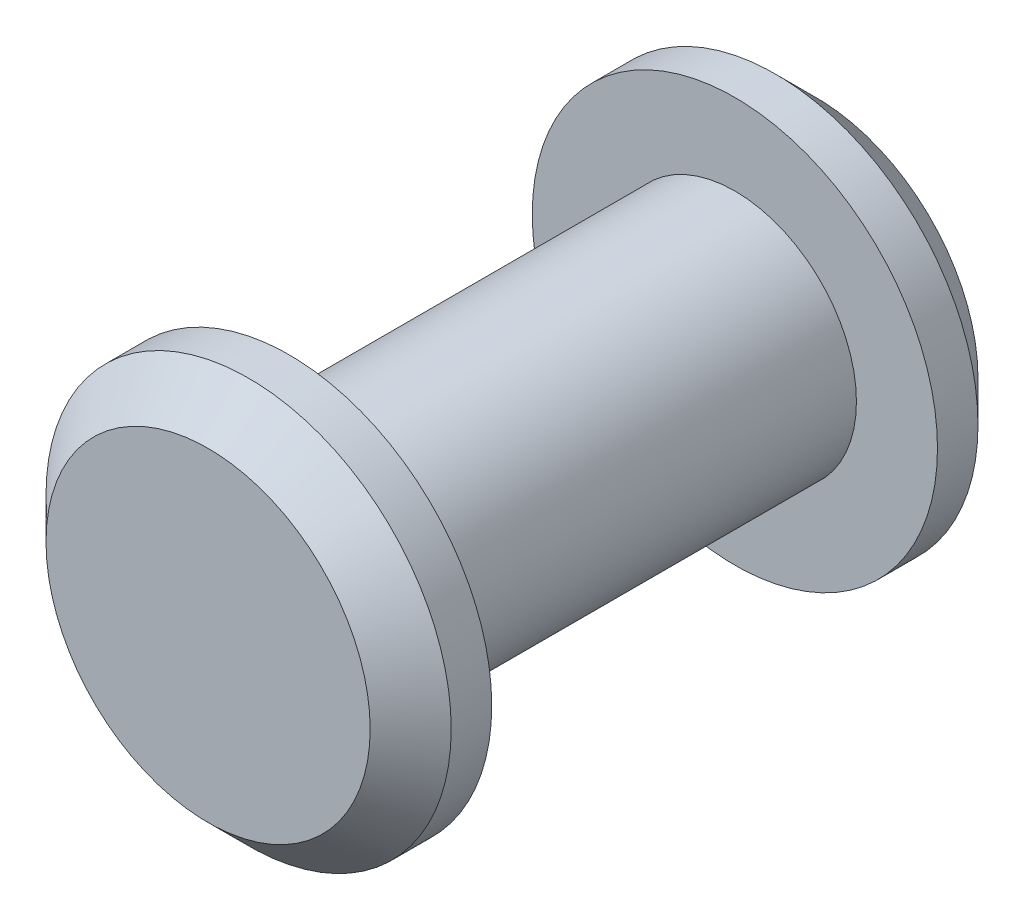
ISO-10303-21;
HEADER;
FILE_DESCRIPTION(('STEP AP214'),'2;1');
FILE_NAME('part.step','',(''),(''),'','','');
FILE_SCHEMA(('AUTOMOTIVE_DESIGN { 1 0 10303 214 1 1 1 1 }'));
ENDSEC;
DATA;
#1=APPLICATION_CONTEXT('core data for automotive mechanical design processes');
#2=APPLICATION_PROTOCOL_DEFINITION('international standard','automotive_design',2000,#1);
#3=PRODUCT_CONTEXT('',#1,'mechanical');
#4=PRODUCT('Part','Part','',(#3));
#5=PRODUCT_RELATED_PRODUCT_CATEGORY('part','',(#4));
#6=PRODUCT_DEFINITION_FORMATION('','',#4);
#7=PRODUCT_DEFINITION_CONTEXT('part definition',#1,'design');
#8=PRODUCT_DEFINITION('design','',#6,#7);
#9=PRODUCT_DEFINITION_SHAPE('','',#8);
#10=(LENGTH_UNIT() NAMED_UNIT(*) SI_UNIT(.MILLI.,.METRE.));
#11=(NAMED_UNIT(*) PLANE_ANGLE_UNIT() SI_UNIT($,.RADIAN.));
#12=(NAMED_UNIT(*) SI_UNIT($,.STERADIAN.) SOLID_ANGLE_UNIT());
#13=UNCERTAINTY_MEASURE_WITH_UNIT(LENGTH_MEASURE(1.E-05),#10,'distance_accuracy_value','');
#14=(GEOMETRIC_REPRESENTATION_CONTEXT(3) GLOBAL_UNCERTAINTY_ASSIGNED_CONTEXT((#13)) GLOBAL_UNIT_ASSIGNED_CONTEXT((#10,
#11,#12)) REPRESENTATION_CONTEXT('',''));
#15=CARTESIAN_POINT('',(0.,0.,0.));
#16=DIRECTION('',(0.,0.,1.));
#17=DIRECTION('',(1.,0.,0.));
#18=AXIS2_PLACEMENT_3D('',#15,#16,#17);
#19=CARTESIAN_POINT('',(0.,0.,-13.));
#20=DIRECTION('',(0.,0.,1.));
#21=DIRECTION('',(1.,0.,0.));
#22=AXIS2_PLACEMENT_3D('',#19,#20,#21);
#23=CONICAL_SURFACE('',#22,10.,0.785398163397447);
#24=CARTESIAN_POINT('',(0.,0.,-15.));
#25=DIRECTION('',(0.,0.,1.));
#26=DIRECTION('',(1.,0.,0.));
#27=AXIS2_PLACEMENT_3D('',#24,#25,#26);
#28=CIRCLE('',#27,8.);
#29=CARTESIAN_POINT('',(8.,0.,-15.));
#30=VERTEX_POINT('',#29);
#31=EDGE_CURVE('E10',#30,#30,#28,.T.);
#32=ORIENTED_EDGE('',*,*,#31,.T.);
#33=EDGE_LOOP('',(#32));
#34=FACE_BOUND('',#33,.T.);
#35=CARTESIAN_POINT('',(0.,0.,-13.));
#36=DIRECTION('',(0.,0.,1.));
#37=DIRECTION('',(1.,0.,0.));
#38=AXIS2_PLACEMENT_3D('',#35,#36,#37);
#39=CIRCLE('',#38,10.);
#40=CARTESIAN_POINT('',(10.,0.,-13.));
#41=VERTEX_POINT('',#40);
#42=EDGE_CURVE('E59',#41,#41,#39,.T.);
#43=ORIENTED_EDGE('',*,*,#42,.F.);
#44=EDGE_LOOP('',(#43));
#45=FACE_BOUND('',#44,.T.);
#46=ADVANCED_FACE('F31',(#34,#45),#23,.T.);
#47=CARTESIAN_POINT('',(0.,0.,-15.));
#48=DIRECTION('',(0.,0.,-1.));
#49=DIRECTION('',(-1.,0.,0.));
#50=AXIS2_PLACEMENT_3D('',#47,#48,#49);
#51=PLANE('',#50);
#52=ORIENTED_EDGE('',*,*,#31,.F.);
#53=EDGE_LOOP('',(#52));
#54=FACE_BOUND('',#53,.T.);
#55=ADVANCED_FACE('F67',(#54),#51,.T.);
#56=CARTESIAN_POINT('',(0.,0.,15.));
#57=DIRECTION('',(0.,0.,1.));
#58=DIRECTION('',(1.,0.,0.));
#59=AXIS2_PLACEMENT_3D('',#56,#57,#58);
#60=PLANE('',#59);
#61=CARTESIAN_POINT('',(0.,0.,15.));
#62=DIRECTION('',(0.,0.,1.));
#63=DIRECTION('',(1.,0.,0.));
#64=AXIS2_PLACEMENT_3D('',#61,#62,#63);
#65=CIRCLE('',#64,8.);
#66=CARTESIAN_POINT('',(8.,0.,15.));
#67=VERTEX_POINT('',#66);
#68=EDGE_CURVE('E37',#67,#67,#65,.T.);
#69=ORIENTED_EDGE('',*,*,#68,.T.);
#70=EDGE_LOOP('',(#69));
#71=FACE_BOUND('',#70,.T.);
#72=ADVANCED_FACE('F71',(#71),#60,.T.);
#73=CARTESIAN_POINT('',(0.,0.,15.));
#74=DIRECTION('',(0.,0.,-1.));
#75=DIRECTION('',(-1.,0.,0.));
#76=AXIS2_PLACEMENT_3D('',#73,#74,#75);
#77=CONICAL_SURFACE('',#76,8.,0.785398163397448);
#78=CARTESIAN_POINT('',(0.,0.,13.));
#79=DIRECTION('',(0.,0.,1.));
#80=DIRECTION('',(1.,0.,0.));
#81=AXIS2_PLACEMENT_3D('',#78,#79,#80);
#82=CIRCLE('',#81,10.);
#83=CARTESIAN_POINT('',(10.,0.,13.));
#84=VERTEX_POINT('',#83);
#85=EDGE_CURVE('E41',#84,#84,#82,.T.);
#86=ORIENTED_EDGE('',*,*,#85,.T.);
#87=EDGE_LOOP('',(#86));
#88=FACE_BOUND('',#87,.T.);
#89=ORIENTED_EDGE('',*,*,#68,.F.);
#90=EDGE_LOOP('',(#89));
#91=FACE_BOUND('',#90,.T.);
#92=ADVANCED_FACE('F76',(#88,#91),#77,.T.);
#93=CARTESIAN_POINT('',(0.,0.,15.));
#94=DIRECTION('',(0.,0.,1.));
#95=DIRECTION('',(1.,0.,0.));
#96=AXIS2_PLACEMENT_3D('',#93,#94,#95);
#97=CYLINDRICAL_SURFACE('',#96,10.);
#98=CARTESIAN_POINT('',(0.,0.,11.));
#99=DIRECTION('',(0.,0.,1.));
#100=DIRECTION('',(1.,0.,0.));
#101=AXIS2_PLACEMENT_3D('',#98,#99,#100);
#102=CIRCLE('',#101,10.);
#103=CARTESIAN_POINT('',(10.,0.,11.));
#104=VERTEX_POINT('',#103);
#105=EDGE_CURVE('E45',#104,#104,#102,.T.);
#106=ORIENTED_EDGE('',*,*,#105,.T.);
#107=EDGE_LOOP('',(#106));
#108=FACE_BOUND('',#107,.T.);
#109=ORIENTED_EDGE('',*,*,#85,.F.);
#110=EDGE_LOOP('',(#109));
#111=FACE_BOUND('',#110,.T.);
#112=ADVANCED_FACE('F81',(#108,#111),#97,.T.);
#113=CARTESIAN_POINT('',(10.,0.,11.));
#114=DIRECTION('',(0.,0.,-1.));
#115=DIRECTION('',(-1.,0.,0.));
#116=AXIS2_PLACEMENT_3D('',#113,#114,#115);
#117=PLANE('',#116);
#118=CARTESIAN_POINT('',(0.,0.,11.));
#119=DIRECTION('',(0.,0.,1.));
#120=DIRECTION('',(1.,0.,0.));
#121=AXIS2_PLACEMENT_3D('',#118,#119,#120);
#122=CIRCLE('',#121,6.);
#123=CARTESIAN_POINT('',(6.,0.,11.));
#124=VERTEX_POINT('',#123);
#125=EDGE_CURVE('E50',#124,#124,#122,.T.);
#126=ORIENTED_EDGE('',*,*,#125,.T.);
#127=EDGE_LOOP('',(#126));
#128=FACE_BOUND('',#127,.T.);
#129=ORIENTED_EDGE('',*,*,#105,.F.);
#130=EDGE_LOOP('',(#129));
#131=FACE_BOUND('',#130,.T.);
#132=ADVANCED_FACE('F85',(#128,#131),#117,.T.);
#133=CARTESIAN_POINT('',(0.,0.,15.));
#134=DIRECTION('',(0.,0.,1.));
#135=DIRECTION('',(1.,0.,0.));
#136=AXIS2_PLACEMENT_3D('',#133,#134,#135);
#137=CYLINDRICAL_SURFACE('',#136,6.);
#138=CARTESIAN_POINT('',(0.,0.,-11.));
#139=DIRECTION('',(0.,0.,1.));
#140=DIRECTION('',(1.,0.,0.));
#141=AXIS2_PLACEMENT_3D('',#138,#139,#140);
#142=CIRCLE('',#141,6.);
#143=CARTESIAN_POINT('',(6.,0.,-11.));
#144=VERTEX_POINT('',#143);
#145=EDGE_CURVE('E53',#144,#144,#142,.T.);
#146=ORIENTED_EDGE('',*,*,#145,.T.);
#147=EDGE_LOOP('',(#146));
#148=FACE_BOUND('',#147,.T.);
#149=ORIENTED_EDGE('',*,*,#125,.F.);
#150=EDGE_LOOP('',(#149));
#151=FACE_BOUND('',#150,.T.);
#152=ADVANCED_FACE('F89',(#148,#151),#137,.T.);
#153=CARTESIAN_POINT('',(10.,0.,-11.));
#154=DIRECTION('',(0.,0.,1.));
#155=DIRECTION('',(1.,0.,0.));
#156=AXIS2_PLACEMENT_3D('',#153,#154,#155);
#157=PLANE('',#156);
#158=CARTESIAN_POINT('',(0.,0.,-11.));
#159=DIRECTION('',(0.,0.,1.));
#160=DIRECTION('',(1.,0.,0.));
#161=AXIS2_PLACEMENT_3D('',#158,#159,#160);
#162=CIRCLE('',#161,10.);
#163=CARTESIAN_POINT('',(10.,0.,-11.));
#164=VERTEX_POINT('',#163);
#165=EDGE_CURVE('E56',#164,#164,#162,.T.);
#166=ORIENTED_EDGE('',*,*,#165,.T.);
#167=EDGE_LOOP('',(#166));
#168=FACE_BOUND('',#167,.T.);
#169=ORIENTED_EDGE('',*,*,#145,.F.);
#170=EDGE_LOOP('',(#169));
#171=FACE_BOUND('',#170,.T.);
#172=ADVANCED_FACE('F93',(#168,#171),#157,.T.);
#173=CARTESIAN_POINT('',(0.,0.,15.));
#174=DIRECTION('',(0.,0.,1.));
#175=DIRECTION('',(1.,0.,0.));
#176=AXIS2_PLACEMENT_3D('',#173,#174,#175);
#177=CYLINDRICAL_SURFACE('',#176,10.);
#178=ORIENTED_EDGE('',*,*,#42,.T.);
#179=EDGE_LOOP('',(#178));
#180=FACE_BOUND('',#179,.T.);
#181=ORIENTED_EDGE('',*,*,#165,.F.);
#182=EDGE_LOOP('',(#181));
#183=FACE_BOUND('',#182,.T.);
#184=ADVANCED_FACE('F63',(#180,#183),#177,.T.);
#185=CLOSED_SHELL('',(#46,#55,#72,#92,#112,#132,#152,#172,#184));
#186=MANIFOLD_SOLID_BREP('B2',#185);
#187=ADVANCED_BREP_SHAPE_REPRESENTATION('',(#18,#186),#14);
#188=SHAPE_DEFINITION_REPRESENTATION(#9,#187);
ENDSEC;
END-ISO-10303-21;
